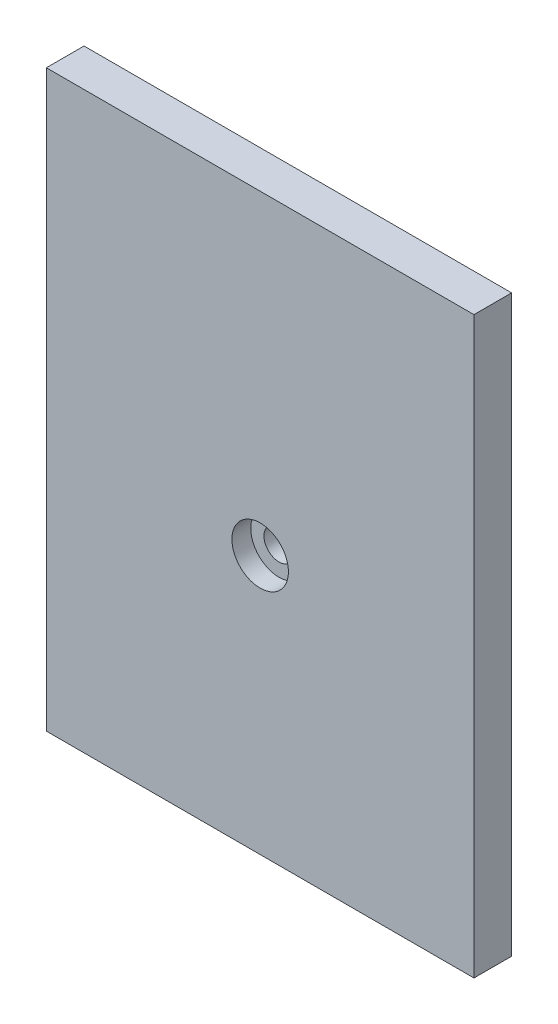
ISO-10303-21;
HEADER;
FILE_DESCRIPTION(('STEP AP214'),'2;1');
FILE_NAME('part.step','',(''),(''),'','','');
FILE_SCHEMA(('AUTOMOTIVE_DESIGN { 1 0 10303 214 1 1 1 1 }'));
ENDSEC;
DATA;
#1=APPLICATION_CONTEXT('core data for automotive mechanical design processes');
#2=APPLICATION_PROTOCOL_DEFINITION('international standard','automotive_design',2000,#1);
#3=PRODUCT_CONTEXT('',#1,'mechanical');
#4=PRODUCT('Part','Part','',(#3));
#5=PRODUCT_RELATED_PRODUCT_CATEGORY('part','',(#4));
#6=PRODUCT_DEFINITION_FORMATION('','',#4);
#7=PRODUCT_DEFINITION_CONTEXT('part definition',#1,'design');
#8=PRODUCT_DEFINITION('design','',#6,#7);
#9=PRODUCT_DEFINITION_SHAPE('','',#8);
#10=(LENGTH_UNIT() NAMED_UNIT(*) SI_UNIT(.MILLI.,.METRE.));
#11=(NAMED_UNIT(*) PLANE_ANGLE_UNIT() SI_UNIT($,.RADIAN.));
#12=(NAMED_UNIT(*) SI_UNIT($,.STERADIAN.) SOLID_ANGLE_UNIT());
#13=UNCERTAINTY_MEASURE_WITH_UNIT(LENGTH_MEASURE(1.E-05),#10,'distance_accuracy_value','');
#14=(GEOMETRIC_REPRESENTATION_CONTEXT(3) GLOBAL_UNCERTAINTY_ASSIGNED_CONTEXT((#13)) GLOBAL_UNIT_ASSIGNED_CONTEXT((#10,
#11,#12)) REPRESENTATION_CONTEXT('',''));
#15=CARTESIAN_POINT('',(0.,0.,0.));
#16=DIRECTION('',(0.,0.,1.));
#17=DIRECTION('',(1.,0.,0.));
#18=AXIS2_PLACEMENT_3D('',#15,#16,#17);
#19=CARTESIAN_POINT('',(-49.7410358565737,10.1116633484172,-6.));
#20=DIRECTION('',(0.,0.,1.));
#21=DIRECTION('',(1.,0.,0.));
#22=AXIS2_PLACEMENT_3D('',#19,#20,#21);
#23=CYLINDRICAL_SURFACE('',#22,1.6);
#24=CARTESIAN_POINT('',(-49.7410358565737,10.1116633484172,0.));
#25=DIRECTION('',(0.,0.,1.));
#26=DIRECTION('',(1.,0.,0.));
#27=AXIS2_PLACEMENT_3D('',#24,#25,#26);
#28=CIRCLE('',#27,1.6);
#29=CARTESIAN_POINT('',(-48.1410358565737,10.1116633484172,0.));
#30=VERTEX_POINT('',#29);
#31=EDGE_CURVE('E145',#30,#30,#28,.T.);
#32=ORIENTED_EDGE('',*,*,#31,.F.);
#33=EDGE_LOOP('',(#32));
#34=FACE_BOUND('',#33,.T.);
#35=CARTESIAN_POINT('',(-49.7410358565737,10.1116633484172,2.));
#36=DIRECTION('',(0.,0.,1.));
#37=DIRECTION('',(1.,0.,0.));
#38=AXIS2_PLACEMENT_3D('',#35,#36,#37);
#39=CIRCLE('',#38,1.6);
#40=CARTESIAN_POINT('',(-48.1410358565737,10.1116633484172,2.));
#41=VERTEX_POINT('',#40);
#42=EDGE_CURVE('E179',#41,#41,#39,.F.);
#43=ORIENTED_EDGE('',*,*,#42,.F.);
#44=EDGE_LOOP('',(#43));
#45=FACE_BOUND('',#44,.T.);
#46=ADVANCED_FACE('F39',(#34,#45),#23,.F.);
#47=CARTESIAN_POINT('',(-72.4410358565737,43.6116633484172,4.));
#48=DIRECTION('',(1.,0.,0.));
#49=DIRECTION('',(0.,1.,0.));
#50=AXIS2_PLACEMENT_3D('',#47,#48,#49);
#51=PLANE('',#50);
#52=DIRECTION('',(0.,-1.,0.));
#53=VECTOR('',#52,1.);
#54=CARTESIAN_POINT('',(-72.4410358565737,43.6116633484172,0.));
#55=LINE('',#54,#53);
#56=CARTESIAN_POINT('',(-72.4410358565737,43.6116633484172,0.));
#57=VERTEX_POINT('',#56);
#58=CARTESIAN_POINT('',(-72.4410358565737,-17.3883366515828,0.));
#59=VERTEX_POINT('',#58);
#60=EDGE_CURVE('E149',#57,#59,#55,.T.);
#61=ORIENTED_EDGE('',*,*,#60,.T.);
#62=DIRECTION('',(0.,0.,-1.));
#63=VECTOR('',#62,1.);
#64=CARTESIAN_POINT('',(-72.4410358565737,-17.3883366515828,4.));
#65=LINE('',#64,#63);
#66=CARTESIAN_POINT('',(-72.4410358565737,-17.3883366515828,4.));
#67=VERTEX_POINT('',#66);
#68=EDGE_CURVE('E175',#67,#59,#65,.T.);
#69=ORIENTED_EDGE('',*,*,#68,.F.);
#70=DIRECTION('',(0.,-1.,0.));
#71=VECTOR('',#70,1.);
#72=CARTESIAN_POINT('',(-72.4410358565737,43.6116633484172,4.));
#73=LINE('',#72,#71);
#74=CARTESIAN_POINT('',(-72.4410358565737,43.6116633484172,4.));
#75=VERTEX_POINT('',#74);
#76=EDGE_CURVE('E153',#75,#67,#73,.T.);
#77=ORIENTED_EDGE('',*,*,#76,.F.);
#78=DIRECTION('',(0.,0.,-1.));
#79=VECTOR('',#78,1.);
#80=CARTESIAN_POINT('',(-72.4410358565737,43.6116633484172,4.));
#81=LINE('',#80,#79);
#82=EDGE_CURVE('E159',#75,#57,#81,.T.);
#83=ORIENTED_EDGE('',*,*,#82,.T.);
#84=EDGE_LOOP('',(#61,#69,#77,#83));
#85=FACE_BOUND('',#84,.T.);
#86=ADVANCED_FACE('F41',(#85),#51,.F.);
#87=CARTESIAN_POINT('',(-72.4410358565737,-17.3883366515828,4.));
#88=DIRECTION('',(0.,1.,0.));
#89=DIRECTION('',(0.,0.,1.));
#90=AXIS2_PLACEMENT_3D('',#87,#88,#89);
#91=PLANE('',#90);
#92=DIRECTION('',(1.,0.,0.));
#93=VECTOR('',#92,1.);
#94=CARTESIAN_POINT('',(-72.4410358565737,-17.3883366515828,0.));
#95=LINE('',#94,#93);
#96=CARTESIAN_POINT('',(-55.9910358565737,-17.3883366515828,0.));
#97=VERTEX_POINT('',#96);
#98=EDGE_CURVE('E163',#59,#97,#95,.T.);
#99=ORIENTED_EDGE('',*,*,#98,.T.);
#100=DIRECTION('',(0.,0.,-1.));
#101=VECTOR('',#100,1.);
#102=CARTESIAN_POINT('',(-55.9910358565737,-17.3883366515828,3.2));
#103=LINE('',#102,#101);
#104=CARTESIAN_POINT('',(-55.9910358565737,-17.3883366515828,3.2));
#105=VERTEX_POINT('',#104);
#106=EDGE_CURVE('E150',#105,#97,#103,.T.);
#107=ORIENTED_EDGE('',*,*,#106,.F.);
#108=DIRECTION('',(-1.,0.,0.));
#109=VECTOR('',#108,1.);
#110=CARTESIAN_POINT('',(-43.4910358565737,-17.3883366515828,3.2));
#111=LINE('',#110,#109);
#112=CARTESIAN_POINT('',(-43.4910358565737,-17.3883366515828,3.2));
#113=VERTEX_POINT('',#112);
#114=EDGE_CURVE('E129',#113,#105,#111,.T.);
#115=ORIENTED_EDGE('',*,*,#114,.F.);
#116=DIRECTION('',(0.,0.,-1.));
#117=VECTOR('',#116,1.);
#118=CARTESIAN_POINT('',(-43.4910358565737,-17.3883366515828,3.2));
#119=LINE('',#118,#117);
#120=CARTESIAN_POINT('',(-43.4910358565737,-17.3883366515828,0.));
#121=VERTEX_POINT('',#120);
#122=EDGE_CURVE('E120',#113,#121,#119,.T.);
#123=ORIENTED_EDGE('',*,*,#122,.T.);
#124=CARTESIAN_POINT('',(-27.0410358565737,-17.3883366515828,0.));
#125=VERTEX_POINT('',#124);
#126=EDGE_CURVE('E162',#121,#125,#95,.T.);
#127=ORIENTED_EDGE('',*,*,#126,.T.);
#128=DIRECTION('',(0.,0.,-1.));
#129=VECTOR('',#128,1.);
#130=CARTESIAN_POINT('',(-27.0410358565737,-17.3883366515828,4.));
#131=LINE('',#130,#129);
#132=CARTESIAN_POINT('',(-27.0410358565737,-17.3883366515828,4.));
#133=VERTEX_POINT('',#132);
#134=EDGE_CURVE('E172',#133,#125,#131,.T.);
#135=ORIENTED_EDGE('',*,*,#134,.F.);
#136=DIRECTION('',(1.,0.,0.));
#137=VECTOR('',#136,1.);
#138=CARTESIAN_POINT('',(-72.4410358565737,-17.3883366515828,4.));
#139=LINE('',#138,#137);
#140=EDGE_CURVE('E92',#67,#133,#139,.T.);
#141=ORIENTED_EDGE('',*,*,#140,.F.);
#142=ORIENTED_EDGE('',*,*,#68,.T.);
#143=EDGE_LOOP('',(#99,#107,#115,#123,#127,#135,#141,#142));
#144=FACE_BOUND('',#143,.T.);
#145=ADVANCED_FACE('F206',(#144),#91,.F.);
#146=CARTESIAN_POINT('',(-27.0410358565737,43.6116633484172,4.));
#147=DIRECTION('',(-1.,0.,0.));
#148=DIRECTION('',(0.,-1.,0.));
#149=AXIS2_PLACEMENT_3D('',#146,#147,#148);
#150=PLANE('',#149);
#151=DIRECTION('',(0.,1.,0.));
#152=VECTOR('',#151,1.);
#153=CARTESIAN_POINT('',(-27.0410358565737,43.6116633484172,0.));
#154=LINE('',#153,#152);
#155=CARTESIAN_POINT('',(-27.0410358565737,43.6116633484172,0.));
#156=VERTEX_POINT('',#155);
#157=EDGE_CURVE('E166',#125,#156,#154,.T.);
#158=ORIENTED_EDGE('',*,*,#157,.T.);
#159=DIRECTION('',(0.,0.,-1.));
#160=VECTOR('',#159,1.);
#161=CARTESIAN_POINT('',(-27.0410358565737,43.6116633484172,4.));
#162=LINE('',#161,#160);
#163=CARTESIAN_POINT('',(-27.0410358565737,43.6116633484172,4.));
#164=VERTEX_POINT('',#163);
#165=EDGE_CURVE('E170',#164,#156,#162,.T.);
#166=ORIENTED_EDGE('',*,*,#165,.F.);
#167=DIRECTION('',(0.,1.,0.));
#168=VECTOR('',#167,1.);
#169=CARTESIAN_POINT('',(-27.0410358565737,43.6116633484172,4.));
#170=LINE('',#169,#168);
#171=EDGE_CURVE('E156',#133,#164,#170,.T.);
#172=ORIENTED_EDGE('',*,*,#171,.F.);
#173=ORIENTED_EDGE('',*,*,#134,.T.);
#174=EDGE_LOOP('',(#158,#166,#172,#173));
#175=FACE_BOUND('',#174,.T.);
#176=ADVANCED_FACE('F303',(#175),#150,.F.);
#177=CARTESIAN_POINT('',(-72.4410358565737,43.6116633484172,4.));
#178=DIRECTION('',(0.,-1.,0.));
#179=DIRECTION('',(0.,0.,-1.));
#180=AXIS2_PLACEMENT_3D('',#177,#178,#179);
#181=PLANE('',#180);
#182=DIRECTION('',(-1.,0.,0.));
#183=VECTOR('',#182,1.);
#184=CARTESIAN_POINT('',(-72.4410358565737,43.6116633484172,0.));
#185=LINE('',#184,#183);
#186=EDGE_CURVE('E84',#156,#57,#185,.T.);
#187=ORIENTED_EDGE('',*,*,#186,.T.);
#188=ORIENTED_EDGE('',*,*,#82,.F.);
#189=DIRECTION('',(-1.,0.,0.));
#190=VECTOR('',#189,1.);
#191=CARTESIAN_POINT('',(-72.4410358565737,43.6116633484172,4.));
#192=LINE('',#191,#190);
#193=EDGE_CURVE('E63',#164,#75,#192,.T.);
#194=ORIENTED_EDGE('',*,*,#193,.F.);
#195=ORIENTED_EDGE('',*,*,#165,.T.);
#196=EDGE_LOOP('',(#187,#188,#194,#195));
#197=FACE_BOUND('',#196,.T.);
#198=ADVANCED_FACE('F296',(#197),#181,.F.);
#199=CARTESIAN_POINT('',(0.,0.,4.));
#200=DIRECTION('',(0.,0.,1.));
#201=DIRECTION('',(1.,0.,0.));
#202=AXIS2_PLACEMENT_3D('',#199,#200,#201);
#203=PLANE('',#202);
#204=CARTESIAN_POINT('',(-49.7410358565737,10.1116633484172,4.));
#205=DIRECTION('',(0.,0.,1.));
#206=DIRECTION('',(1.,0.,0.));
#207=AXIS2_PLACEMENT_3D('',#204,#205,#206);
#208=CIRCLE('',#207,3.);
#209=CARTESIAN_POINT('',(-46.7410358565737,10.1116633484172,4.));
#210=VERTEX_POINT('',#209);
#211=EDGE_CURVE('E139',#210,#210,#208,.T.);
#212=ORIENTED_EDGE('',*,*,#211,.F.);
#213=EDGE_LOOP('',(#212));
#214=FACE_BOUND('',#213,.T.);
#215=ORIENTED_EDGE('',*,*,#76,.T.);
#216=ORIENTED_EDGE('',*,*,#140,.T.);
#217=ORIENTED_EDGE('',*,*,#171,.T.);
#218=ORIENTED_EDGE('',*,*,#193,.T.);
#219=EDGE_LOOP('',(#215,#216,#217,#218));
#220=FACE_BOUND('',#219,.T.);
#221=ADVANCED_FACE('F190',(#214,#220),#203,.T.);
#222=CARTESIAN_POINT('',(0.,0.,0.));
#223=DIRECTION('',(0.,0.,1.));
#224=DIRECTION('',(1.,0.,0.));
#225=AXIS2_PLACEMENT_3D('',#222,#223,#224);
#226=PLANE('',#225);
#227=CARTESIAN_POINT('',(-39.7410358565737,20.1116633484172,0.));
#228=DIRECTION('',(0.,0.,1.));
#229=DIRECTION('',(1.,0.,0.));
#230=AXIS2_PLACEMENT_3D('',#227,#228,#229);
#231=CIRCLE('',#230,3.05);
#232=CARTESIAN_POINT('',(-36.6910358565737,20.1116633484172,0.));
#233=VERTEX_POINT('',#232);
#234=EDGE_CURVE('E11',#233,#233,#231,.F.);
#235=ORIENTED_EDGE('',*,*,#234,.F.);
#236=EDGE_LOOP('',(#235));
#237=FACE_BOUND('',#236,.T.);
#238=CARTESIAN_POINT('',(-39.7410358565737,0.111663348417231,0.));
#239=DIRECTION('',(0.,0.,1.));
#240=DIRECTION('',(1.,0.,0.));
#241=AXIS2_PLACEMENT_3D('',#238,#239,#240);
#242=CIRCLE('',#241,3.05000000000001);
#243=CARTESIAN_POINT('',(-36.6910358565737,0.111663348417231,0.));
#244=VERTEX_POINT('',#243);
#245=EDGE_CURVE('E47',#244,#244,#242,.F.);
#246=ORIENTED_EDGE('',*,*,#245,.F.);
#247=EDGE_LOOP('',(#246));
#248=FACE_BOUND('',#247,.T.);
#249=CARTESIAN_POINT('',(-59.7410358565737,20.1116633484172,0.));
#250=DIRECTION('',(0.,0.,-1.));
#251=DIRECTION('',(-1.,0.,0.));
#252=AXIS2_PLACEMENT_3D('',#249,#250,#251);
#253=CIRCLE('',#252,3.05);
#254=CARTESIAN_POINT('',(-62.7910358565737,20.1116633484172,0.));
#255=VERTEX_POINT('',#254);
#256=EDGE_CURVE('E196',#255,#255,#253,.F.);
#257=ORIENTED_EDGE('',*,*,#256,.T.);
#258=EDGE_LOOP('',(#257));
#259=FACE_BOUND('',#258,.T.);
#260=CARTESIAN_POINT('',(-59.7410358565737,0.111663348417258,0.));
#261=DIRECTION('',(0.,0.,-1.));
#262=DIRECTION('',(-1.,0.,0.));
#263=AXIS2_PLACEMENT_3D('',#260,#261,#262);
#264=CIRCLE('',#263,3.05000000000001);
#265=CARTESIAN_POINT('',(-62.7910358565737,0.111663348417258,0.));
#266=VERTEX_POINT('',#265);
#267=EDGE_CURVE('E200',#266,#266,#264,.F.);
#268=ORIENTED_EDGE('',*,*,#267,.T.);
#269=EDGE_LOOP('',(#268));
#270=FACE_BOUND('',#269,.T.);
#271=ORIENTED_EDGE('',*,*,#31,.T.);
#272=EDGE_LOOP('',(#271));
#273=FACE_BOUND('',#272,.T.);
#274=DIRECTION('',(1.,0.,0.));
#275=VECTOR('',#274,1.);
#276=CARTESIAN_POINT('',(-43.4910358565737,0.611663348417227,0.));
#277=LINE('',#276,#275);
#278=CARTESIAN_POINT('',(-55.9910358565737,0.611663348417227,0.));
#279=VERTEX_POINT('',#278);
#280=CARTESIAN_POINT('',(-43.4910358565737,0.611663348417227,0.));
#281=VERTEX_POINT('',#280);
#282=EDGE_CURVE('E54',#279,#281,#277,.T.);
#283=ORIENTED_EDGE('',*,*,#282,.F.);
#284=DIRECTION('',(0.,1.,0.));
#285=VECTOR('',#284,1.);
#286=CARTESIAN_POINT('',(-55.9910358565737,0.611663348417227,0.));
#287=LINE('',#286,#285);
#288=EDGE_CURVE('E133',#97,#279,#287,.T.);
#289=ORIENTED_EDGE('',*,*,#288,.F.);
#290=ORIENTED_EDGE('',*,*,#98,.F.);
#291=ORIENTED_EDGE('',*,*,#60,.F.);
#292=ORIENTED_EDGE('',*,*,#186,.F.);
#293=ORIENTED_EDGE('',*,*,#157,.F.);
#294=ORIENTED_EDGE('',*,*,#126,.F.);
#295=DIRECTION('',(0.,-1.,0.));
#296=VECTOR('',#295,1.);
#297=CARTESIAN_POINT('',(-43.4910358565737,0.611663348417227,0.));
#298=LINE('',#297,#296);
#299=EDGE_CURVE('E136',#281,#121,#298,.T.);
#300=ORIENTED_EDGE('',*,*,#299,.F.);
#301=EDGE_LOOP('',(#283,#289,#290,#291,#292,#293,#294,#300));
#302=FACE_BOUND('',#301,.T.);
#303=ADVANCED_FACE('F187',(#237,#248,#259,#270,#273,#302),#226,.F.);
#304=CARTESIAN_POINT('',(-43.4910358565737,0.611663348417227,3.2));
#305=DIRECTION('',(0.,1.,0.));
#306=DIRECTION('',(0.,0.,1.));
#307=AXIS2_PLACEMENT_3D('',#304,#305,#306);
#308=PLANE('',#307);
#309=ORIENTED_EDGE('',*,*,#282,.T.);
#310=DIRECTION('',(0.,0.,-1.));
#311=VECTOR('',#310,1.);
#312=CARTESIAN_POINT('',(-43.4910358565737,0.611663348417227,3.2));
#313=LINE('',#312,#311);
#314=CARTESIAN_POINT('',(-43.4910358565737,0.611663348417227,3.2));
#315=VERTEX_POINT('',#314);
#316=EDGE_CURVE('E112',#315,#281,#313,.T.);
#317=ORIENTED_EDGE('',*,*,#316,.F.);
#318=DIRECTION('',(1.,0.,0.));
#319=VECTOR('',#318,1.);
#320=CARTESIAN_POINT('',(-43.4910358565737,0.611663348417227,3.2));
#321=LINE('',#320,#319);
#322=CARTESIAN_POINT('',(-55.9910358565737,0.611663348417227,3.2));
#323=VERTEX_POINT('',#322);
#324=EDGE_CURVE('E116',#323,#315,#321,.T.);
#325=ORIENTED_EDGE('',*,*,#324,.F.);
#326=DIRECTION('',(0.,0.,-1.));
#327=VECTOR('',#326,1.);
#328=CARTESIAN_POINT('',(-55.9910358565737,0.611663348417227,3.2));
#329=LINE('',#328,#327);
#330=EDGE_CURVE('E147',#323,#279,#329,.T.);
#331=ORIENTED_EDGE('',*,*,#330,.T.);
#332=EDGE_LOOP('',(#309,#317,#325,#331));
#333=FACE_BOUND('',#332,.T.);
#334=ADVANCED_FACE('F114',(#333),#308,.F.);
#335=CARTESIAN_POINT('',(-55.9910358565737,0.611663348417227,3.2));
#336=DIRECTION('',(-1.,0.,0.));
#337=DIRECTION('',(0.,0.,1.));
#338=AXIS2_PLACEMENT_3D('',#335,#336,#337);
#339=PLANE('',#338);
#340=ORIENTED_EDGE('',*,*,#288,.T.);
#341=ORIENTED_EDGE('',*,*,#330,.F.);
#342=DIRECTION('',(0.,1.,0.));
#343=VECTOR('',#342,1.);
#344=CARTESIAN_POINT('',(-55.9910358565737,0.611663348417227,3.2));
#345=LINE('',#344,#343);
#346=EDGE_CURVE('E121',#105,#323,#345,.T.);
#347=ORIENTED_EDGE('',*,*,#346,.F.);
#348=ORIENTED_EDGE('',*,*,#106,.T.);
#349=EDGE_LOOP('',(#340,#341,#347,#348));
#350=FACE_BOUND('',#349,.T.);
#351=ADVANCED_FACE('F209',(#350),#339,.F.);
#352=CARTESIAN_POINT('',(-43.4910358565737,0.611663348417227,3.2));
#353=DIRECTION('',(1.,0.,0.));
#354=DIRECTION('',(0.,0.,-1.));
#355=AXIS2_PLACEMENT_3D('',#352,#353,#354);
#356=PLANE('',#355);
#357=ORIENTED_EDGE('',*,*,#299,.T.);
#358=ORIENTED_EDGE('',*,*,#122,.F.);
#359=DIRECTION('',(0.,-1.,0.));
#360=VECTOR('',#359,1.);
#361=CARTESIAN_POINT('',(-43.4910358565737,0.611663348417227,3.2));
#362=LINE('',#361,#360);
#363=EDGE_CURVE('E124',#315,#113,#362,.T.);
#364=ORIENTED_EDGE('',*,*,#363,.F.);
#365=ORIENTED_EDGE('',*,*,#316,.T.);
#366=EDGE_LOOP('',(#357,#358,#364,#365));
#367=FACE_BOUND('',#366,.T.);
#368=ADVANCED_FACE('F125',(#367),#356,.F.);
#369=CARTESIAN_POINT('',(0.,0.,3.2));
#370=DIRECTION('',(0.,0.,1.));
#371=DIRECTION('',(1.,0.,0.));
#372=AXIS2_PLACEMENT_3D('',#369,#370,#371);
#373=PLANE('',#372);
#374=ORIENTED_EDGE('',*,*,#324,.T.);
#375=ORIENTED_EDGE('',*,*,#363,.T.);
#376=ORIENTED_EDGE('',*,*,#114,.T.);
#377=ORIENTED_EDGE('',*,*,#346,.T.);
#378=EDGE_LOOP('',(#374,#375,#376,#377));
#379=FACE_BOUND('',#378,.T.);
#380=ADVANCED_FACE('F131',(#379),#373,.F.);
#381=CARTESIAN_POINT('',(-49.7410358565737,10.1116633484172,2.));
#382=DIRECTION('',(0.,0.,1.));
#383=DIRECTION('',(1.,0.,0.));
#384=AXIS2_PLACEMENT_3D('',#381,#382,#383);
#385=PLANE('',#384);
#386=CARTESIAN_POINT('',(-49.7410358565737,10.1116633484172,2.));
#387=DIRECTION('',(0.,0.,1.));
#388=DIRECTION('',(1.,0.,0.));
#389=AXIS2_PLACEMENT_3D('',#386,#387,#388);
#390=CIRCLE('',#389,3.);
#391=CARTESIAN_POINT('',(-46.7410358565737,10.1116633484172,2.));
#392=VERTEX_POINT('',#391);
#393=EDGE_CURVE('E181',#392,#392,#390,.T.);
#394=ORIENTED_EDGE('',*,*,#393,.T.);
#395=EDGE_LOOP('',(#394));
#396=FACE_BOUND('',#395,.T.);
#397=ORIENTED_EDGE('',*,*,#42,.T.);
#398=EDGE_LOOP('',(#397));
#399=FACE_BOUND('',#398,.T.);
#400=ADVANCED_FACE('F231',(#396,#399),#385,.T.);
#401=CARTESIAN_POINT('',(-49.7410358565737,10.1116633484172,2.));
#402=DIRECTION('',(0.,0.,1.));
#403=DIRECTION('',(1.,0.,0.));
#404=AXIS2_PLACEMENT_3D('',#401,#402,#403);
#405=CYLINDRICAL_SURFACE('',#404,3.);
#406=ORIENTED_EDGE('',*,*,#393,.F.);
#407=EDGE_LOOP('',(#406));
#408=FACE_BOUND('',#407,.T.);
#409=ORIENTED_EDGE('',*,*,#211,.T.);
#410=EDGE_LOOP('',(#409));
#411=FACE_BOUND('',#410,.T.);
#412=ADVANCED_FACE('F228',(#408,#411),#405,.F.);
#413=CARTESIAN_POINT('',(-59.7410358565737,0.111663348417258,-1.5));
#414=DIRECTION('',(0.,0.,1.));
#415=DIRECTION('',(1.,0.,0.));
#416=AXIS2_PLACEMENT_3D('',#413,#414,#415);
#417=CYLINDRICAL_SURFACE('',#416,3.05000000000001);
#418=CARTESIAN_POINT('',(-59.7410358565737,0.111663348417258,-1.5));
#419=DIRECTION('',(0.,0.,-1.));
#420=DIRECTION('',(-1.,0.,0.));
#421=AXIS2_PLACEMENT_3D('',#418,#419,#420);
#422=CIRCLE('',#421,3.05000000000001);
#423=CARTESIAN_POINT('',(-62.7910358565737,0.111663348417258,-1.5));
#424=VERTEX_POINT('',#423);
#425=EDGE_CURVE('E287',#424,#424,#422,.F.);
#426=ORIENTED_EDGE('',*,*,#425,.T.);
#427=EDGE_LOOP('',(#426));
#428=FACE_BOUND('',#427,.T.);
#429=ORIENTED_EDGE('',*,*,#267,.F.);
#430=EDGE_LOOP('',(#429));
#431=FACE_BOUND('',#430,.T.);
#432=ADVANCED_FACE('F239',(#428,#431),#417,.T.);
#433=CARTESIAN_POINT('',(0.,0.,-1.5));
#434=DIRECTION('',(0.,0.,-1.));
#435=DIRECTION('',(-1.,0.,0.));
#436=AXIS2_PLACEMENT_3D('',#433,#434,#435);
#437=PLANE('',#436);
#438=ORIENTED_EDGE('',*,*,#425,.F.);
#439=EDGE_LOOP('',(#438));
#440=FACE_BOUND('',#439,.T.);
#441=ADVANCED_FACE('F246',(#440),#437,.T.);
#442=CARTESIAN_POINT('',(-59.7410358565737,20.1116633484172,-1.5));
#443=DIRECTION('',(0.,0.,1.));
#444=DIRECTION('',(1.,0.,0.));
#445=AXIS2_PLACEMENT_3D('',#442,#443,#444);
#446=CYLINDRICAL_SURFACE('',#445,3.05);
#447=CARTESIAN_POINT('',(-59.7410358565737,20.1116633484172,-1.5));
#448=DIRECTION('',(0.,0.,-1.));
#449=DIRECTION('',(-1.,0.,0.));
#450=AXIS2_PLACEMENT_3D('',#447,#448,#449);
#451=CIRCLE('',#450,3.05);
#452=CARTESIAN_POINT('',(-62.7910358565737,20.1116633484172,-1.5));
#453=VERTEX_POINT('',#452);
#454=EDGE_CURVE('E283',#453,#453,#451,.F.);
#455=ORIENTED_EDGE('',*,*,#454,.T.);
#456=EDGE_LOOP('',(#455));
#457=FACE_BOUND('',#456,.T.);
#458=ORIENTED_EDGE('',*,*,#256,.F.);
#459=EDGE_LOOP('',(#458));
#460=FACE_BOUND('',#459,.T.);
#461=ADVANCED_FACE('F250',(#457,#460),#446,.T.);
#462=CARTESIAN_POINT('',(0.,0.,-1.5));
#463=DIRECTION('',(0.,0.,-1.));
#464=DIRECTION('',(-1.,0.,0.));
#465=AXIS2_PLACEMENT_3D('',#462,#463,#464);
#466=PLANE('',#465);
#467=ORIENTED_EDGE('',*,*,#454,.F.);
#468=EDGE_LOOP('',(#467));
#469=FACE_BOUND('',#468,.T.);
#470=ADVANCED_FACE('F254',(#469),#466,.T.);
#471=CARTESIAN_POINT('',(-39.7410358565737,0.111663348417231,-1.5));
#472=DIRECTION('',(0.,0.,1.));
#473=DIRECTION('',(1.,0.,0.));
#474=AXIS2_PLACEMENT_3D('',#471,#472,#473);
#475=CYLINDRICAL_SURFACE('',#474,3.05000000000001);
#476=CARTESIAN_POINT('',(-39.7410358565737,0.111663348417231,-1.5));
#477=DIRECTION('',(0.,0.,-1.));
#478=DIRECTION('',(-1.,0.,0.));
#479=AXIS2_PLACEMENT_3D('',#476,#477,#478);
#480=CIRCLE('',#479,3.05000000000001);
#481=CARTESIAN_POINT('',(-42.7910358565737,0.111663348417231,-1.5));
#482=VERTEX_POINT('',#481);
#483=EDGE_CURVE('E278',#482,#482,#480,.T.);
#484=ORIENTED_EDGE('',*,*,#483,.F.);
#485=EDGE_LOOP('',(#484));
#486=FACE_BOUND('',#485,.T.);
#487=ORIENTED_EDGE('',*,*,#245,.T.);
#488=EDGE_LOOP('',(#487));
#489=FACE_BOUND('',#488,.T.);
#490=ADVANCED_FACE('F185',(#486,#489),#475,.T.);
#491=CARTESIAN_POINT('',(0.,0.,-1.5));
#492=DIRECTION('',(0.,0.,-1.));
#493=DIRECTION('',(-1.,0.,0.));
#494=AXIS2_PLACEMENT_3D('',#491,#492,#493);
#495=PLANE('',#494);
#496=ORIENTED_EDGE('',*,*,#483,.T.);
#497=EDGE_LOOP('',(#496));
#498=FACE_BOUND('',#497,.T.);
#499=ADVANCED_FACE('F261',(#498),#495,.T.);
#500=CARTESIAN_POINT('',(-39.7410358565737,20.1116633484172,-1.5));
#501=DIRECTION('',(0.,0.,1.));
#502=DIRECTION('',(1.,0.,0.));
#503=AXIS2_PLACEMENT_3D('',#500,#501,#502);
#504=CYLINDRICAL_SURFACE('',#503,3.05);
#505=CARTESIAN_POINT('',(-39.7410358565737,20.1116633484172,-1.5));
#506=DIRECTION('',(0.,0.,-1.));
#507=DIRECTION('',(-1.,0.,0.));
#508=AXIS2_PLACEMENT_3D('',#505,#506,#507);
#509=CIRCLE('',#508,3.05);
#510=CARTESIAN_POINT('',(-42.7910358565737,20.1116633484172,-1.5));
#511=VERTEX_POINT('',#510);
#512=EDGE_CURVE('E277',#511,#511,#509,.T.);
#513=ORIENTED_EDGE('',*,*,#512,.F.);
#514=EDGE_LOOP('',(#513));
#515=FACE_BOUND('',#514,.T.);
#516=ORIENTED_EDGE('',*,*,#234,.T.);
#517=EDGE_LOOP('',(#516));
#518=FACE_BOUND('',#517,.T.);
#519=ADVANCED_FACE('F265',(#515,#518),#504,.T.);
#520=CARTESIAN_POINT('',(0.,0.,-1.5));
#521=DIRECTION('',(0.,0.,-1.));
#522=DIRECTION('',(-1.,0.,0.));
#523=AXIS2_PLACEMENT_3D('',#520,#521,#522);
#524=PLANE('',#523);
#525=ORIENTED_EDGE('',*,*,#512,.T.);
#526=EDGE_LOOP('',(#525));
#527=FACE_BOUND('',#526,.T.);
#528=ADVANCED_FACE('F269',(#527),#524,.T.);
#529=CLOSED_SHELL('',(#46,#86,#145,#176,#198,#221,#303,#334,#351,#368,#380,#400,#412,#432,#441,
#461,#470,#490,#499,#519,#528));
#530=MANIFOLD_SOLID_BREP('B2',#529);
#531=ADVANCED_BREP_SHAPE_REPRESENTATION('',(#18,#530),#14);
#532=SHAPE_DEFINITION_REPRESENTATION(#9,#531);
ENDSEC;
END-ISO-10303-21;
